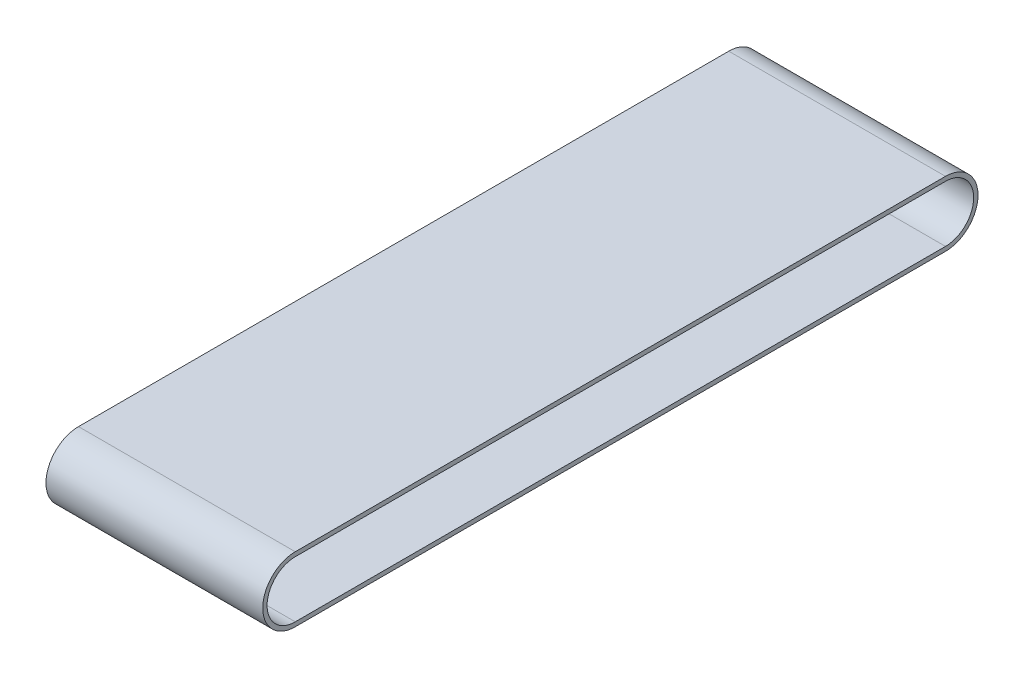
ISO-10303-21;
HEADER;
FILE_DESCRIPTION(('STEP AP214'),'2;1');
FILE_NAME('part.step','',(''),(''),'','','');
FILE_SCHEMA(('AUTOMOTIVE_DESIGN { 1 0 10303 214 1 1 1 1 }'));
ENDSEC;
DATA;
#1=APPLICATION_CONTEXT('core data for automotive mechanical design processes');
#2=APPLICATION_PROTOCOL_DEFINITION('international standard','automotive_design',2000,#1);
#3=PRODUCT_CONTEXT('',#1,'mechanical');
#4=PRODUCT('Part','Part','',(#3));
#5=PRODUCT_RELATED_PRODUCT_CATEGORY('part','',(#4));
#6=PRODUCT_DEFINITION_FORMATION('','',#4);
#7=PRODUCT_DEFINITION_CONTEXT('part definition',#1,'design');
#8=PRODUCT_DEFINITION('design','',#6,#7);
#9=PRODUCT_DEFINITION_SHAPE('','',#8);
#10=(LENGTH_UNIT() NAMED_UNIT(*) SI_UNIT(.MILLI.,.METRE.));
#11=(NAMED_UNIT(*) PLANE_ANGLE_UNIT() SI_UNIT($,.RADIAN.));
#12=(NAMED_UNIT(*) SI_UNIT($,.STERADIAN.) SOLID_ANGLE_UNIT());
#13=UNCERTAINTY_MEASURE_WITH_UNIT(LENGTH_MEASURE(1.E-05),#10,'distance_accuracy_value','');
#14=(GEOMETRIC_REPRESENTATION_CONTEXT(3) GLOBAL_UNCERTAINTY_ASSIGNED_CONTEXT((#13)) GLOBAL_UNIT_ASSIGNED_CONTEXT((#10,
#11,#12)) REPRESENTATION_CONTEXT('',''));
#15=CARTESIAN_POINT('',(0.,0.,0.));
#16=DIRECTION('',(0.,0.,1.));
#17=DIRECTION('',(1.,0.,0.));
#18=AXIS2_PLACEMENT_3D('',#15,#16,#17);
#19=CARTESIAN_POINT('',(100.,22.8481012658228,183.678713125152));
#20=DIRECTION('',(1.,0.,0.));
#21=DIRECTION('',(0.,0.,-1.));
#22=AXIS2_PLACEMENT_3D('',#19,#20,#21);
#23=PLANE('',#22);
#24=CARTESIAN_POINT('',(100.,22.8481012658228,183.678713125152));
#25=DIRECTION('',(1.,0.,0.));
#26=DIRECTION('',(0.,0.,-1.));
#27=AXIS2_PLACEMENT_3D('',#24,#25,#26);
#28=CIRCLE('',#27,15.);
#29=CARTESIAN_POINT('',(100.,37.8481012658228,183.678713125152));
#30=VERTEX_POINT('',#29);
#31=CARTESIAN_POINT('',(100.,7.84810126582282,183.678713125152));
#32=VERTEX_POINT('',#31);
#33=EDGE_CURVE('E134',#30,#32,#28,.T.);
#34=ORIENTED_EDGE('',*,*,#33,.T.);
#35=DIRECTION('',(0.,0.,-1.));
#36=VECTOR('',#35,1.);
#37=CARTESIAN_POINT('',(100.,7.84810126582282,183.678713125152));
#38=LINE('',#37,#36);
#39=CARTESIAN_POINT('',(100.,7.84810126582286,-116.321286874848));
#40=VERTEX_POINT('',#39);
#41=EDGE_CURVE('E137',#32,#40,#38,.T.);
#42=ORIENTED_EDGE('',*,*,#41,.T.);
#43=CARTESIAN_POINT('',(100.,22.8481012658229,-116.321286874848));
#44=DIRECTION('',(1.,0.,0.));
#45=DIRECTION('',(0.,0.,1.));
#46=AXIS2_PLACEMENT_3D('',#43,#44,#45);
#47=CIRCLE('',#46,15.);
#48=CARTESIAN_POINT('',(100.,37.8481012658229,-116.321286874848));
#49=VERTEX_POINT('',#48);
#50=EDGE_CURVE('E140',#40,#49,#47,.T.);
#51=ORIENTED_EDGE('',*,*,#50,.T.);
#52=DIRECTION('',(0.,0.,1.));
#53=VECTOR('',#52,1.);
#54=CARTESIAN_POINT('',(100.,37.8481012658228,183.678713125152));
#55=LINE('',#54,#53);
#56=EDGE_CURVE('E142',#49,#30,#55,.T.);
#57=ORIENTED_EDGE('',*,*,#56,.T.);
#58=EDGE_LOOP('',(#34,#42,#51,#57));
#59=FACE_BOUND('',#58,.T.);
#60=DIRECTION('',(0.,0.,-1.));
#61=VECTOR('',#60,1.);
#62=CARTESIAN_POINT('',(100.,9.84810126582282,183.678713125152));
#63=LINE('',#62,#61);
#64=CARTESIAN_POINT('',(100.,9.84810126582282,183.678713125152));
#65=VERTEX_POINT('',#64);
#66=CARTESIAN_POINT('',(100.,9.84810126582284,-116.321286874848));
#67=VERTEX_POINT('',#66);
#68=EDGE_CURVE('E106',#65,#67,#63,.T.);
#69=ORIENTED_EDGE('',*,*,#68,.F.);
#70=CARTESIAN_POINT('',(100.,22.8481012658228,183.678713125152));
#71=DIRECTION('',(1.,0.,0.));
#72=DIRECTION('',(0.,0.,-1.));
#73=AXIS2_PLACEMENT_3D('',#70,#71,#72);
#74=CIRCLE('',#73,13.);
#75=CARTESIAN_POINT('',(100.,35.8481012658228,183.678713125152));
#76=VERTEX_POINT('',#75);
#77=EDGE_CURVE('E98',#76,#65,#74,.T.);
#78=ORIENTED_EDGE('',*,*,#77,.F.);
#79=DIRECTION('',(0.,0.,1.));
#80=VECTOR('',#79,1.);
#81=CARTESIAN_POINT('',(100.,35.8481012658228,183.678713125152));
#82=LINE('',#81,#80);
#83=CARTESIAN_POINT('',(100.,35.8481012658229,-116.321286874848));
#84=VERTEX_POINT('',#83);
#85=EDGE_CURVE('E120',#84,#76,#82,.T.);
#86=ORIENTED_EDGE('',*,*,#85,.F.);
#87=CARTESIAN_POINT('',(100.,22.8481012658229,-116.321286874848));
#88=DIRECTION('',(1.,0.,0.));
#89=DIRECTION('',(0.,0.,1.));
#90=AXIS2_PLACEMENT_3D('',#87,#88,#89);
#91=CIRCLE('',#90,13.);
#92=EDGE_CURVE('E118',#67,#84,#91,.T.);
#93=ORIENTED_EDGE('',*,*,#92,.F.);
#94=EDGE_LOOP('',(#69,#78,#86,#93));
#95=FACE_BOUND('',#94,.T.);
#96=ADVANCED_FACE('F33',(#59,#95),#23,.T.);
#97=CARTESIAN_POINT('',(0.,22.8481012658228,183.678713125152));
#98=DIRECTION('',(1.,0.,0.));
#99=DIRECTION('',(0.,0.,-1.));
#100=AXIS2_PLACEMENT_3D('',#97,#98,#99);
#101=PLANE('',#100);
#102=CARTESIAN_POINT('',(0.,22.8481012658228,183.678713125152));
#103=DIRECTION('',(1.,0.,0.));
#104=DIRECTION('',(0.,0.,-1.));
#105=AXIS2_PLACEMENT_3D('',#102,#103,#104);
#106=CIRCLE('',#105,15.);
#107=CARTESIAN_POINT('',(0.,37.8481012658228,183.678713125152));
#108=VERTEX_POINT('',#107);
#109=CARTESIAN_POINT('',(0.,7.84810126582282,183.678713125152));
#110=VERTEX_POINT('',#109);
#111=EDGE_CURVE('E114',#108,#110,#106,.T.);
#112=ORIENTED_EDGE('',*,*,#111,.F.);
#113=DIRECTION('',(0.,0.,1.));
#114=VECTOR('',#113,1.);
#115=CARTESIAN_POINT('',(0.,37.8481012658228,183.678713125152));
#116=LINE('',#115,#114);
#117=CARTESIAN_POINT('',(0.,37.8481012658229,-116.321286874848));
#118=VERTEX_POINT('',#117);
#119=EDGE_CURVE('E138',#118,#108,#116,.T.);
#120=ORIENTED_EDGE('',*,*,#119,.F.);
#121=CARTESIAN_POINT('',(0.,22.8481012658229,-116.321286874848));
#122=DIRECTION('',(1.,0.,0.));
#123=DIRECTION('',(0.,0.,1.));
#124=AXIS2_PLACEMENT_3D('',#121,#122,#123);
#125=CIRCLE('',#124,15.);
#126=CARTESIAN_POINT('',(0.,7.84810126582286,-116.321286874848));
#127=VERTEX_POINT('',#126);
#128=EDGE_CURVE('E149',#127,#118,#125,.T.);
#129=ORIENTED_EDGE('',*,*,#128,.F.);
#130=DIRECTION('',(0.,0.,-1.));
#131=VECTOR('',#130,1.);
#132=CARTESIAN_POINT('',(0.,7.84810126582282,183.678713125152));
#133=LINE('',#132,#131);
#134=EDGE_CURVE('E147',#110,#127,#133,.T.);
#135=ORIENTED_EDGE('',*,*,#134,.F.);
#136=EDGE_LOOP('',(#112,#120,#129,#135));
#137=FACE_BOUND('',#136,.T.);
#138=CARTESIAN_POINT('',(0.,22.8481012658228,183.678713125152));
#139=DIRECTION('',(1.,0.,0.));
#140=DIRECTION('',(0.,0.,-1.));
#141=AXIS2_PLACEMENT_3D('',#138,#139,#140);
#142=CIRCLE('',#141,13.);
#143=CARTESIAN_POINT('',(0.,35.8481012658228,183.678713125152));
#144=VERTEX_POINT('',#143);
#145=CARTESIAN_POINT('',(0.,9.84810126582282,183.678713125152));
#146=VERTEX_POINT('',#145);
#147=EDGE_CURVE('E56',#144,#146,#142,.T.);
#148=ORIENTED_EDGE('',*,*,#147,.T.);
#149=DIRECTION('',(0.,0.,-1.));
#150=VECTOR('',#149,1.);
#151=CARTESIAN_POINT('',(0.,9.84810126582282,183.678713125152));
#152=LINE('',#151,#150);
#153=CARTESIAN_POINT('',(0.,9.84810126582284,-116.321286874848));
#154=VERTEX_POINT('',#153);
#155=EDGE_CURVE('E113',#146,#154,#152,.T.);
#156=ORIENTED_EDGE('',*,*,#155,.T.);
#157=CARTESIAN_POINT('',(0.,22.8481012658229,-116.321286874848));
#158=DIRECTION('',(1.,0.,0.));
#159=DIRECTION('',(0.,0.,1.));
#160=AXIS2_PLACEMENT_3D('',#157,#158,#159);
#161=CIRCLE('',#160,13.);
#162=CARTESIAN_POINT('',(0.,35.8481012658229,-116.321286874848));
#163=VERTEX_POINT('',#162);
#164=EDGE_CURVE('E126',#154,#163,#161,.T.);
#165=ORIENTED_EDGE('',*,*,#164,.T.);
#166=DIRECTION('',(0.,0.,1.));
#167=VECTOR('',#166,1.);
#168=CARTESIAN_POINT('',(0.,35.8481012658228,183.678713125152));
#169=LINE('',#168,#167);
#170=EDGE_CURVE('E107',#163,#144,#169,.T.);
#171=ORIENTED_EDGE('',*,*,#170,.T.);
#172=EDGE_LOOP('',(#148,#156,#165,#171));
#173=FACE_BOUND('',#172,.T.);
#174=ADVANCED_FACE('F167',(#137,#173),#101,.F.);
#175=CARTESIAN_POINT('',(100.,22.8481012658228,183.678713125152));
#176=DIRECTION('',(-1.,0.,0.));
#177=DIRECTION('',(0.,0.,1.));
#178=AXIS2_PLACEMENT_3D('',#175,#176,#177);
#179=CYLINDRICAL_SURFACE('',#178,15.);
#180=ORIENTED_EDGE('',*,*,#111,.T.);
#181=DIRECTION('',(-1.,0.,0.));
#182=VECTOR('',#181,1.);
#183=CARTESIAN_POINT('',(100.,7.84810126582282,183.678713125152));
#184=LINE('',#183,#182);
#185=EDGE_CURVE('E11',#32,#110,#184,.T.);
#186=ORIENTED_EDGE('',*,*,#185,.F.);
#187=ORIENTED_EDGE('',*,*,#33,.F.);
#188=DIRECTION('',(-1.,0.,0.));
#189=VECTOR('',#188,1.);
#190=CARTESIAN_POINT('',(100.,37.8481012658228,183.678713125152));
#191=LINE('',#190,#189);
#192=EDGE_CURVE('E144',#30,#108,#191,.T.);
#193=ORIENTED_EDGE('',*,*,#192,.T.);
#194=EDGE_LOOP('',(#180,#186,#187,#193));
#195=FACE_BOUND('',#194,.T.);
#196=ADVANCED_FACE('F35',(#195),#179,.T.);
#197=CARTESIAN_POINT('',(100.,7.84810126582282,183.678713125152));
#198=DIRECTION('',(0.,1.,0.));
#199=DIRECTION('',(0.,0.,1.));
#200=AXIS2_PLACEMENT_3D('',#197,#198,#199);
#201=PLANE('',#200);
#202=ORIENTED_EDGE('',*,*,#134,.T.);
#203=DIRECTION('',(-1.,0.,0.));
#204=VECTOR('',#203,1.);
#205=CARTESIAN_POINT('',(100.,7.84810126582286,-116.321286874848));
#206=LINE('',#205,#204);
#207=EDGE_CURVE('E41',#40,#127,#206,.T.);
#208=ORIENTED_EDGE('',*,*,#207,.F.);
#209=ORIENTED_EDGE('',*,*,#41,.F.);
#210=ORIENTED_EDGE('',*,*,#185,.T.);
#211=EDGE_LOOP('',(#202,#208,#209,#210));
#212=FACE_BOUND('',#211,.T.);
#213=ADVANCED_FACE('F177',(#212),#201,.F.);
#214=CARTESIAN_POINT('',(100.,22.8481012658229,-116.321286874848));
#215=DIRECTION('',(-1.,0.,0.));
#216=DIRECTION('',(0.,0.,1.));
#217=AXIS2_PLACEMENT_3D('',#214,#215,#216);
#218=CYLINDRICAL_SURFACE('',#217,15.);
#219=ORIENTED_EDGE('',*,*,#128,.T.);
#220=DIRECTION('',(-1.,0.,0.));
#221=VECTOR('',#220,1.);
#222=CARTESIAN_POINT('',(100.,37.8481012658229,-116.321286874848));
#223=LINE('',#222,#221);
#224=EDGE_CURVE('E154',#49,#118,#223,.T.);
#225=ORIENTED_EDGE('',*,*,#224,.F.);
#226=ORIENTED_EDGE('',*,*,#50,.F.);
#227=ORIENTED_EDGE('',*,*,#207,.T.);
#228=EDGE_LOOP('',(#219,#225,#226,#227));
#229=FACE_BOUND('',#228,.T.);
#230=ADVANCED_FACE('F161',(#229),#218,.T.);
#231=CARTESIAN_POINT('',(100.,37.8481012658228,183.678713125152));
#232=DIRECTION('',(0.,-1.,0.));
#233=DIRECTION('',(0.,0.,-1.));
#234=AXIS2_PLACEMENT_3D('',#231,#232,#233);
#235=PLANE('',#234);
#236=ORIENTED_EDGE('',*,*,#119,.T.);
#237=ORIENTED_EDGE('',*,*,#192,.F.);
#238=ORIENTED_EDGE('',*,*,#56,.F.);
#239=ORIENTED_EDGE('',*,*,#224,.T.);
#240=EDGE_LOOP('',(#236,#237,#238,#239));
#241=FACE_BOUND('',#240,.T.);
#242=ADVANCED_FACE('F171',(#241),#235,.F.);
#243=CARTESIAN_POINT('',(100.,22.8481012658228,183.678713125152));
#244=DIRECTION('',(-1.,0.,0.));
#245=DIRECTION('',(0.,0.,1.));
#246=AXIS2_PLACEMENT_3D('',#243,#244,#245);
#247=CYLINDRICAL_SURFACE('',#246,13.);
#248=ORIENTED_EDGE('',*,*,#147,.F.);
#249=DIRECTION('',(-1.,0.,0.));
#250=VECTOR('',#249,1.);
#251=CARTESIAN_POINT('',(100.,35.8481012658228,183.678713125152));
#252=LINE('',#251,#250);
#253=EDGE_CURVE('E102',#76,#144,#252,.T.);
#254=ORIENTED_EDGE('',*,*,#253,.F.);
#255=ORIENTED_EDGE('',*,*,#77,.T.);
#256=DIRECTION('',(-1.,0.,0.));
#257=VECTOR('',#256,1.);
#258=CARTESIAN_POINT('',(100.,9.84810126582282,183.678713125152));
#259=LINE('',#258,#257);
#260=EDGE_CURVE('E101',#65,#146,#259,.T.);
#261=ORIENTED_EDGE('',*,*,#260,.T.);
#262=EDGE_LOOP('',(#248,#254,#255,#261));
#263=FACE_BOUND('',#262,.T.);
#264=ADVANCED_FACE('F100',(#263),#247,.F.);
#265=CARTESIAN_POINT('',(100.,9.84810126582282,183.678713125152));
#266=DIRECTION('',(0.,1.,0.));
#267=DIRECTION('',(0.,0.,1.));
#268=AXIS2_PLACEMENT_3D('',#265,#266,#267);
#269=PLANE('',#268);
#270=ORIENTED_EDGE('',*,*,#155,.F.);
#271=ORIENTED_EDGE('',*,*,#260,.F.);
#272=ORIENTED_EDGE('',*,*,#68,.T.);
#273=DIRECTION('',(-1.,0.,0.));
#274=VECTOR('',#273,1.);
#275=CARTESIAN_POINT('',(100.,9.84810126582284,-116.321286874848));
#276=LINE('',#275,#274);
#277=EDGE_CURVE('E115',#67,#154,#276,.T.);
#278=ORIENTED_EDGE('',*,*,#277,.T.);
#279=EDGE_LOOP('',(#270,#271,#272,#278));
#280=FACE_BOUND('',#279,.T.);
#281=ADVANCED_FACE('F110',(#280),#269,.T.);
#282=CARTESIAN_POINT('',(100.,22.8481012658229,-116.321286874848));
#283=DIRECTION('',(-1.,0.,0.));
#284=DIRECTION('',(0.,0.,1.));
#285=AXIS2_PLACEMENT_3D('',#282,#283,#284);
#286=CYLINDRICAL_SURFACE('',#285,13.);
#287=ORIENTED_EDGE('',*,*,#164,.F.);
#288=ORIENTED_EDGE('',*,*,#277,.F.);
#289=ORIENTED_EDGE('',*,*,#92,.T.);
#290=DIRECTION('',(-1.,0.,0.));
#291=VECTOR('',#290,1.);
#292=CARTESIAN_POINT('',(100.,35.8481012658229,-116.321286874848));
#293=LINE('',#292,#291);
#294=EDGE_CURVE('E48',#84,#163,#293,.T.);
#295=ORIENTED_EDGE('',*,*,#294,.T.);
#296=EDGE_LOOP('',(#287,#288,#289,#295));
#297=FACE_BOUND('',#296,.T.);
#298=ADVANCED_FACE('F200',(#297),#286,.F.);
#299=CARTESIAN_POINT('',(100.,35.8481012658228,183.678713125152));
#300=DIRECTION('',(0.,-1.,0.));
#301=DIRECTION('',(0.,0.,-1.));
#302=AXIS2_PLACEMENT_3D('',#299,#300,#301);
#303=PLANE('',#302);
#304=ORIENTED_EDGE('',*,*,#170,.F.);
#305=ORIENTED_EDGE('',*,*,#294,.F.);
#306=ORIENTED_EDGE('',*,*,#85,.T.);
#307=ORIENTED_EDGE('',*,*,#253,.T.);
#308=EDGE_LOOP('',(#304,#305,#306,#307));
#309=FACE_BOUND('',#308,.T.);
#310=ADVANCED_FACE('F204',(#309),#303,.T.);
#311=CLOSED_SHELL('',(#96,#174,#196,#213,#230,#242,#264,#281,#298,#310));
#312=MANIFOLD_SOLID_BREP('B2',#311);
#313=ADVANCED_BREP_SHAPE_REPRESENTATION('',(#18,#312),#14);
#314=SHAPE_DEFINITION_REPRESENTATION(#9,#313);
ENDSEC;
END-ISO-10303-21;
